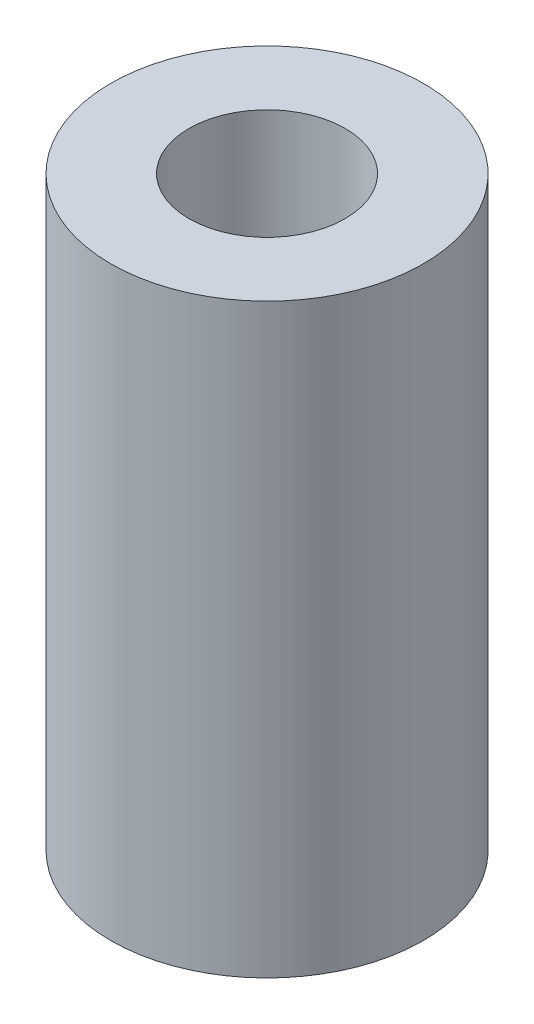
ISO-10303-21;
HEADER;
FILE_DESCRIPTION(('STEP AP214'),'2;1');
FILE_NAME('part.step','',(''),(''),'','','');
FILE_SCHEMA(('AUTOMOTIVE_DESIGN { 1 0 10303 214 1 1 1 1 }'));
ENDSEC;
DATA;
#1=APPLICATION_CONTEXT('core data for automotive mechanical design processes');
#2=APPLICATION_PROTOCOL_DEFINITION('international standard','automotive_design',2000,#1);
#3=PRODUCT_CONTEXT('',#1,'mechanical');
#4=PRODUCT('Part','Part','',(#3));
#5=PRODUCT_RELATED_PRODUCT_CATEGORY('part','',(#4));
#6=PRODUCT_DEFINITION_FORMATION('','',#4);
#7=PRODUCT_DEFINITION_CONTEXT('part definition',#1,'design');
#8=PRODUCT_DEFINITION('design','',#6,#7);
#9=PRODUCT_DEFINITION_SHAPE('','',#8);
#10=(LENGTH_UNIT() NAMED_UNIT(*) SI_UNIT(.MILLI.,.METRE.));
#11=(NAMED_UNIT(*) PLANE_ANGLE_UNIT() SI_UNIT($,.RADIAN.));
#12=(NAMED_UNIT(*) SI_UNIT($,.STERADIAN.) SOLID_ANGLE_UNIT());
#13=UNCERTAINTY_MEASURE_WITH_UNIT(LENGTH_MEASURE(1.E-05),#10,'distance_accuracy_value','');
#14=(GEOMETRIC_REPRESENTATION_CONTEXT(3) GLOBAL_UNCERTAINTY_ASSIGNED_CONTEXT((#13)) GLOBAL_UNIT_ASSIGNED_CONTEXT((#10,
#11,#12)) REPRESENTATION_CONTEXT('',''));
#15=CARTESIAN_POINT('',(0.,0.,0.));
#16=DIRECTION('',(0.,0.,1.));
#17=DIRECTION('',(1.,0.,0.));
#18=AXIS2_PLACEMENT_3D('',#15,#16,#17);
#19=CARTESIAN_POINT('',(0.,15.,0.));
#20=DIRECTION('',(0.,-1.,0.));
#21=DIRECTION('',(0.,0.,-1.));
#22=AXIS2_PLACEMENT_3D('',#19,#20,#21);
#23=CYLINDRICAL_SURFACE('',#22,4.);
#24=CARTESIAN_POINT('',(0.,15.,0.));
#25=DIRECTION('',(0.,1.,0.));
#26=DIRECTION('',(0.,0.,1.));
#27=AXIS2_PLACEMENT_3D('',#24,#25,#26);
#28=CIRCLE('',#27,4.);
#29=CARTESIAN_POINT('',(0.,15.,4.));
#30=VERTEX_POINT('',#29);
#31=EDGE_CURVE('E10',#30,#30,#28,.T.);
#32=ORIENTED_EDGE('',*,*,#31,.F.);
#33=EDGE_LOOP('',(#32));
#34=FACE_BOUND('',#33,.T.);
#35=CARTESIAN_POINT('',(0.,0.,0.));
#36=DIRECTION('',(0.,1.,0.));
#37=DIRECTION('',(0.,0.,1.));
#38=AXIS2_PLACEMENT_3D('',#35,#36,#37);
#39=CIRCLE('',#38,4.);
#40=CARTESIAN_POINT('',(0.,0.,4.));
#41=VERTEX_POINT('',#40);
#42=EDGE_CURVE('E38',#41,#41,#39,.T.);
#43=ORIENTED_EDGE('',*,*,#42,.T.);
#44=EDGE_LOOP('',(#43));
#45=FACE_BOUND('',#44,.T.);
#46=ADVANCED_FACE('F35',(#34,#45),#23,.T.);
#47=CARTESIAN_POINT('',(0.,15.,0.));
#48=DIRECTION('',(0.,1.,0.));
#49=DIRECTION('',(0.,0.,1.));
#50=AXIS2_PLACEMENT_3D('',#47,#48,#49);
#51=PLANE('',#50);
#52=CARTESIAN_POINT('',(0.,15.,0.));
#53=DIRECTION('',(0.,1.,0.));
#54=DIRECTION('',(0.,0.,1.));
#55=AXIS2_PLACEMENT_3D('',#52,#53,#54);
#56=CIRCLE('',#55,2.);
#57=CARTESIAN_POINT('',(0.,15.,2.));
#58=VERTEX_POINT('',#57);
#59=EDGE_CURVE('E49',#58,#58,#56,.T.);
#60=ORIENTED_EDGE('',*,*,#59,.F.);
#61=EDGE_LOOP('',(#60));
#62=FACE_BOUND('',#61,.T.);
#63=ORIENTED_EDGE('',*,*,#31,.T.);
#64=EDGE_LOOP('',(#63));
#65=FACE_BOUND('',#64,.T.);
#66=ADVANCED_FACE('F56',(#62,#65),#51,.T.);
#67=CARTESIAN_POINT('',(0.,0.,0.));
#68=DIRECTION('',(0.,1.,0.));
#69=DIRECTION('',(0.,0.,1.));
#70=AXIS2_PLACEMENT_3D('',#67,#68,#69);
#71=PLANE('',#70);
#72=CARTESIAN_POINT('',(0.,0.,0.));
#73=DIRECTION('',(0.,1.,0.));
#74=DIRECTION('',(0.,0.,1.));
#75=AXIS2_PLACEMENT_3D('',#72,#73,#74);
#76=CIRCLE('',#75,2.);
#77=CARTESIAN_POINT('',(0.,0.,2.));
#78=VERTEX_POINT('',#77);
#79=EDGE_CURVE('E45',#78,#78,#76,.F.);
#80=ORIENTED_EDGE('',*,*,#79,.F.);
#81=EDGE_LOOP('',(#80));
#82=FACE_BOUND('',#81,.T.);
#83=ORIENTED_EDGE('',*,*,#42,.F.);
#84=EDGE_LOOP('',(#83));
#85=FACE_BOUND('',#84,.T.);
#86=ADVANCED_FACE('F58',(#82,#85),#71,.F.);
#87=CARTESIAN_POINT('',(0.,-0.000999999999999265,0.));
#88=DIRECTION('',(0.,1.,0.));
#89=DIRECTION('',(0.,0.,1.));
#90=AXIS2_PLACEMENT_3D('',#87,#88,#89);
#91=CYLINDRICAL_SURFACE('',#90,2.);
#92=CARTESIAN_POINT('',(0.,15.,2.));
#93=CARTESIAN_POINT('',(0.,14.84375,2.));
#94=CARTESIAN_POINT('',(0.,14.6875,2.));
#95=CARTESIAN_POINT('',(0.,14.375,2.));
#96=CARTESIAN_POINT('',(0.,14.21875,2.));
#97=CARTESIAN_POINT('',(0.,13.90625,2.));
#98=CARTESIAN_POINT('',(0.,13.75,2.));
#99=CARTESIAN_POINT('',(0.,13.4375,2.));
#100=CARTESIAN_POINT('',(0.,13.28125,2.));
#101=CARTESIAN_POINT('',(0.,12.96875,2.));
#102=CARTESIAN_POINT('',(0.,12.8125,2.));
#103=CARTESIAN_POINT('',(0.,12.5,2.));
#104=CARTESIAN_POINT('',(0.,12.34375,2.));
#105=CARTESIAN_POINT('',(0.,12.03125,2.));
#106=CARTESIAN_POINT('',(0.,11.875,2.));
#107=CARTESIAN_POINT('',(0.,11.5625,2.));
#108=CARTESIAN_POINT('',(0.,11.40625,2.));
#109=CARTESIAN_POINT('',(0.,11.09375,2.));
#110=CARTESIAN_POINT('',(0.,10.9375,2.));
#111=CARTESIAN_POINT('',(0.,10.625,2.));
#112=CARTESIAN_POINT('',(0.,10.46875,2.));
#113=CARTESIAN_POINT('',(0.,10.15625,2.));
#114=CARTESIAN_POINT('',(0.,10.,2.));
#115=CARTESIAN_POINT('',(0.,9.6875,2.));
#116=CARTESIAN_POINT('',(0.,9.53125,2.));
#117=CARTESIAN_POINT('',(0.,9.21875,2.));
#118=CARTESIAN_POINT('',(0.,9.0625,2.));
#119=CARTESIAN_POINT('',(0.,8.75,2.));
#120=CARTESIAN_POINT('',(0.,8.59375,2.));
#121=CARTESIAN_POINT('',(0.,8.28125,2.));
#122=CARTESIAN_POINT('',(0.,8.125,2.));
#123=CARTESIAN_POINT('',(0.,7.8125,2.));
#124=CARTESIAN_POINT('',(0.,7.65625,2.));
#125=CARTESIAN_POINT('',(0.,7.34375,2.));
#126=CARTESIAN_POINT('',(0.,7.1875,2.));
#127=CARTESIAN_POINT('',(0.,6.875,2.));
#128=CARTESIAN_POINT('',(0.,6.71875,2.));
#129=CARTESIAN_POINT('',(0.,6.40625,2.));
#130=CARTESIAN_POINT('',(0.,6.25,2.));
#131=CARTESIAN_POINT('',(0.,5.9375,2.));
#132=CARTESIAN_POINT('',(0.,5.78125,2.));
#133=CARTESIAN_POINT('',(0.,5.46875,2.));
#134=CARTESIAN_POINT('',(0.,5.3125,2.));
#135=CARTESIAN_POINT('',(0.,5.,2.));
#136=CARTESIAN_POINT('',(0.,4.84375,2.));
#137=CARTESIAN_POINT('',(0.,4.53125,2.));
#138=CARTESIAN_POINT('',(0.,4.375,2.));
#139=CARTESIAN_POINT('',(0.,4.0625,2.));
#140=CARTESIAN_POINT('',(0.,3.90625,2.));
#141=CARTESIAN_POINT('',(0.,3.59375,2.));
#142=CARTESIAN_POINT('',(0.,3.4375,2.));
#143=CARTESIAN_POINT('',(0.,3.125,2.));
#144=CARTESIAN_POINT('',(0.,2.96875,2.));
#145=CARTESIAN_POINT('',(0.,2.65625,2.));
#146=CARTESIAN_POINT('',(0.,2.5,2.));
#147=CARTESIAN_POINT('',(0.,2.1875,2.));
#148=CARTESIAN_POINT('',(0.,2.03125,2.));
#149=CARTESIAN_POINT('',(0.,1.71875,2.));
#150=CARTESIAN_POINT('',(0.,1.5625,2.));
#151=CARTESIAN_POINT('',(0.,1.25,2.));
#152=CARTESIAN_POINT('',(0.,1.09375,2.));
#153=CARTESIAN_POINT('',(0.,0.781250000000001,2.));
#154=CARTESIAN_POINT('',(0.,0.625,2.));
#155=CARTESIAN_POINT('',(0.,0.3125,2.));
#156=CARTESIAN_POINT('',(0.,0.15625,2.));
#157=CARTESIAN_POINT('',(0.,0.,2.));
#158=B_SPLINE_CURVE_WITH_KNOTS('',3,(#92,#93,#94,#95,#96,#97,#98,#99,#100,#101,#102,#103,#104,
#105,#106,#107,#108,#109,#110,#111,#112,#113,#114,#115,#116,#117,#118,#119,#120,#121,#122,#123,
#124,#125,#126,#127,#128,#129,#130,#131,#132,#133,#134,#135,#136,#137,#138,#139,#140,#141,#142,
#143,#144,#145,#146,#147,#148,#149,#150,#151,#152,#153,#154,#155,#156,#157),.UNSPECIFIED.,.F.,
.F.,(4,2,2,2,2,2,2,2,2,2,2,2,2,2,2,2,2,2,2,2,2,2,2,2,2,2,2,2,2,2,2,2,4),(0.,0.46875,
0.937500000000001,1.40625,1.875,2.34375,2.8125,3.28125,3.75,4.21875,4.6875,5.15625,5.625,
6.09375,6.5625,7.03125,7.5,7.96875,8.4375,8.90625,9.375,9.84375,10.3125,10.78125,11.25,11.71875,
12.1875,12.65625,13.125,13.59375,14.0625,14.53125,15.),.UNSPECIFIED.);
#159=EDGE_CURVE('BSEAM53',#58,#78,#158,.T.);
#160=ORIENTED_EDGE('',*,*,#59,.T.);
#161=ORIENTED_EDGE('',*,*,#79,.T.);
#162=ORIENTED_EDGE('',*,*,#159,.T.);
#163=ORIENTED_EDGE('',*,*,#159,.F.);
#164=EDGE_LOOP('',(#160,#162,#161,#163));
#165=FACE_BOUND('',#164,.T.);
#166=ADVANCED_FACE('F53',(#165),#91,.F.);
#167=CLOSED_SHELL('',(#46,#66,#86,#166));
#168=MANIFOLD_SOLID_BREP('B2',#167);
#169=ADVANCED_BREP_SHAPE_REPRESENTATION('',(#18,#168),#14);
#170=SHAPE_DEFINITION_REPRESENTATION(#9,#169);
ENDSEC;
END-ISO-10303-21;
